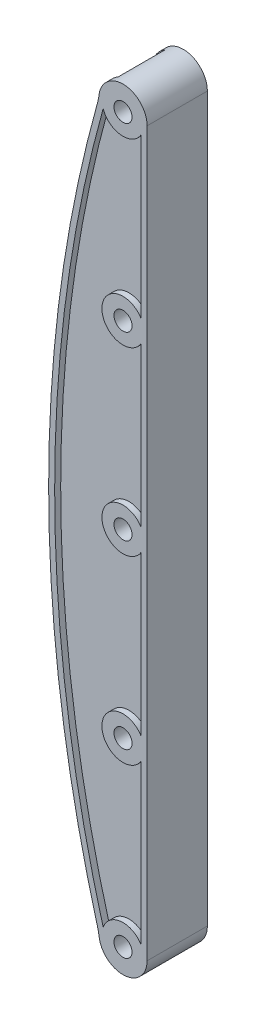
ISO-10303-21;
HEADER;
FILE_DESCRIPTION(('STEP AP214'),'2;1');
FILE_NAME('part.step','',(''),(''),'','','');
FILE_SCHEMA(('AUTOMOTIVE_DESIGN { 1 0 10303 214 1 1 1 1 }'));
ENDSEC;
DATA;
#1=APPLICATION_CONTEXT('core data for automotive mechanical design processes');
#2=APPLICATION_PROTOCOL_DEFINITION('international standard','automotive_design',2000,#1);
#3=PRODUCT_CONTEXT('',#1,'mechanical');
#4=PRODUCT('Part','Part','',(#3));
#5=PRODUCT_RELATED_PRODUCT_CATEGORY('part','',(#4));
#6=PRODUCT_DEFINITION_FORMATION('','',#4);
#7=PRODUCT_DEFINITION_CONTEXT('part definition',#1,'design');
#8=PRODUCT_DEFINITION('design','',#6,#7);
#9=PRODUCT_DEFINITION_SHAPE('','',#8);
#10=(LENGTH_UNIT() NAMED_UNIT(*) SI_UNIT(.MILLI.,.METRE.));
#11=(NAMED_UNIT(*) PLANE_ANGLE_UNIT() SI_UNIT($,.RADIAN.));
#12=(NAMED_UNIT(*) SI_UNIT($,.STERADIAN.) SOLID_ANGLE_UNIT());
#13=UNCERTAINTY_MEASURE_WITH_UNIT(LENGTH_MEASURE(1.E-05),#10,'distance_accuracy_value','');
#14=(GEOMETRIC_REPRESENTATION_CONTEXT(3) GLOBAL_UNCERTAINTY_ASSIGNED_CONTEXT((#13)) GLOBAL_UNIT_ASSIGNED_CONTEXT((#10,
#11,#12)) REPRESENTATION_CONTEXT('',''));
#15=CARTESIAN_POINT('',(0.,0.,0.));
#16=DIRECTION('',(0.,0.,1.));
#17=DIRECTION('',(1.,0.,0.));
#18=AXIS2_PLACEMENT_3D('',#15,#16,#17);
#19=CARTESIAN_POINT('',(0.,60.,5.));
#20=DIRECTION('',(0.,0.,-1.));
#21=DIRECTION('',(-1.,0.,0.));
#22=AXIS2_PLACEMENT_3D('',#19,#20,#21);
#23=CYLINDRICAL_SURFACE('',#22,4.);
#24=CARTESIAN_POINT('',(0.,60.,-3.9));
#25=DIRECTION('',(0.,0.,1.));
#26=DIRECTION('',(1.,0.,0.));
#27=AXIS2_PLACEMENT_3D('',#24,#25,#26);
#28=CIRCLE('',#27,4.);
#29=CARTESIAN_POINT('',(-1.9308097651756,63.5031376865167,-3.9));
#30=VERTEX_POINT('',#29);
#31=CARTESIAN_POINT('',(-3.96732538080456,60.5102247767648,-3.9));
#32=VERTEX_POINT('',#31);
#33=EDGE_CURVE('E210',#30,#32,#28,.T.);
#34=ORIENTED_EDGE('',*,*,#33,.F.);
#35=DIRECTION('',(0.,0.,1.));
#36=VECTOR('',#35,1.);
#37=CARTESIAN_POINT('',(-1.93080976517515,63.5031376865182,0.));
#38=LINE('',#37,#36);
#39=CARTESIAN_POINT('',(-1.9308097651756,63.5031376865167,3.9));
#40=VERTEX_POINT('',#39);
#41=EDGE_CURVE('E202',#40,#30,#38,.F.);
#42=ORIENTED_EDGE('',*,*,#41,.F.);
#43=CARTESIAN_POINT('',(0.,60.,3.9));
#44=DIRECTION('',(0.,0.,1.));
#45=DIRECTION('',(1.,0.,0.));
#46=AXIS2_PLACEMENT_3D('',#43,#44,#45);
#47=CIRCLE('',#46,4.);
#48=CARTESIAN_POINT('',(-3.96732538080456,60.5102247767648,3.9));
#49=VERTEX_POINT('',#48);
#50=EDGE_CURVE('E187',#40,#49,#47,.T.);
#51=ORIENTED_EDGE('',*,*,#50,.T.);
#52=DIRECTION('',(0.,0.,-1.));
#53=VECTOR('',#52,1.);
#54=CARTESIAN_POINT('',(-3.96732538080449,60.5102247767648,5.));
#55=LINE('',#54,#53);
#56=CARTESIAN_POINT('',(-3.96732538080449,60.5102247767648,5.));
#57=VERTEX_POINT('',#56);
#58=EDGE_CURVE('E395',#49,#57,#55,.F.);
#59=ORIENTED_EDGE('',*,*,#58,.T.);
#60=CARTESIAN_POINT('',(0.,60.,5.));
#61=DIRECTION('',(0.,0.,1.));
#62=DIRECTION('',(-1.,0.,0.));
#63=AXIS2_PLACEMENT_3D('',#60,#61,#62);
#64=CIRCLE('',#63,4.);
#65=CARTESIAN_POINT('',(3.99999999999998,60.,5.));
#66=VERTEX_POINT('',#65);
#67=EDGE_CURVE('E345',#66,#57,#64,.T.);
#68=ORIENTED_EDGE('',*,*,#67,.F.);
#69=DIRECTION('',(0.,0.,-1.));
#70=VECTOR('',#69,1.);
#71=CARTESIAN_POINT('',(3.99999999999998,60.,5.));
#72=LINE('',#71,#70);
#73=CARTESIAN_POINT('',(3.99999999999998,60.,-5.));
#74=VERTEX_POINT('',#73);
#75=EDGE_CURVE('E360',#66,#74,#72,.T.);
#76=ORIENTED_EDGE('',*,*,#75,.T.);
#77=CARTESIAN_POINT('',(0.,60.,-5.));
#78=DIRECTION('',(0.,0.,1.));
#79=DIRECTION('',(-1.,0.,0.));
#80=AXIS2_PLACEMENT_3D('',#77,#78,#79);
#81=CIRCLE('',#80,4.);
#82=CARTESIAN_POINT('',(-3.96732538080449,60.5102247767648,-5.));
#83=VERTEX_POINT('',#82);
#84=EDGE_CURVE('E341',#74,#83,#81,.T.);
#85=ORIENTED_EDGE('',*,*,#84,.T.);
#86=EDGE_CURVE('E396',#83,#32,#55,.F.);
#87=ORIENTED_EDGE('',*,*,#86,.T.);
#88=EDGE_LOOP('',(#34,#42,#51,#59,#68,#76,#85,#87));
#89=FACE_BOUND('',#88,.T.);
#90=ADVANCED_FACE('F39',(#89),#23,.T.);
#91=CARTESIAN_POINT('',(207.660104885167,0.,5.));
#92=DIRECTION('',(0.,0.,-1.));
#93=DIRECTION('',(-1.,0.,0.));
#94=AXIS2_PLACEMENT_3D('',#91,#92,#93);
#95=CYLINDRICAL_SURFACE('',#94,220.);
#96=CARTESIAN_POINT('',(207.660104885167,0.,-3.9));
#97=DIRECTION('',(0.,0.,1.));
#98=DIRECTION('',(1.,0.,0.));
#99=AXIS2_PLACEMENT_3D('',#96,#97,#98);
#100=CIRCLE('',#99,220.);
#101=CARTESIAN_POINT('',(-4.25321519290343,59.0994481656908,-3.9));
#102=VERTEX_POINT('',#101);
#103=CARTESIAN_POINT('',(-4.25321519290328,-59.0994481656913,-3.9));
#104=VERTEX_POINT('',#103);
#105=EDGE_CURVE('E417',#102,#104,#100,.T.);
#106=ORIENTED_EDGE('',*,*,#105,.F.);
#107=DIRECTION('',(0.,0.,-1.));
#108=VECTOR('',#107,1.);
#109=CARTESIAN_POINT('',(-4.25321519290348,59.0994481656908,5.));
#110=LINE('',#109,#108);
#111=CARTESIAN_POINT('',(-4.25321519290345,59.0994481656908,-5.));
#112=VERTEX_POINT('',#111);
#113=EDGE_CURVE('E385',#102,#112,#110,.T.);
#114=ORIENTED_EDGE('',*,*,#113,.T.);
#115=CARTESIAN_POINT('',(207.660104885167,0.,-5.));
#116=DIRECTION('',(0.,0.,1.));
#117=DIRECTION('',(1.,0.,0.));
#118=AXIS2_PLACEMENT_3D('',#115,#116,#117);
#119=CIRCLE('',#118,220.);
#120=CARTESIAN_POINT('',(-4.25321519290328,-59.0994481656913,-5.));
#121=VERTEX_POINT('',#120);
#122=EDGE_CURVE('E364',#112,#121,#119,.T.);
#123=ORIENTED_EDGE('',*,*,#122,.T.);
#124=DIRECTION('',(0.,0.,-1.));
#125=VECTOR('',#124,1.);
#126=CARTESIAN_POINT('',(-4.25321519290328,-59.0994481656913,5.));
#127=LINE('',#126,#125);
#128=EDGE_CURVE('E391',#121,#104,#127,.F.);
#129=ORIENTED_EDGE('',*,*,#128,.T.);
#130=EDGE_LOOP('',(#106,#114,#123,#129));
#131=FACE_BOUND('',#130,.T.);
#132=ADVANCED_FACE('F423',(#131),#95,.T.);
#133=CARTESIAN_POINT('',(0.,-60.,5.));
#134=DIRECTION('',(0.,0.,-1.));
#135=DIRECTION('',(-1.,0.,0.));
#136=AXIS2_PLACEMENT_3D('',#133,#134,#135);
#137=CYLINDRICAL_SURFACE('',#136,4.);
#138=CARTESIAN_POINT('',(0.,-60.,-3.9));
#139=DIRECTION('',(0.,0.,1.));
#140=DIRECTION('',(1.,0.,0.));
#141=AXIS2_PLACEMENT_3D('',#138,#139,#140);
#142=CIRCLE('',#141,4.);
#143=CARTESIAN_POINT('',(-3.96732538080447,-60.5102247767649,-3.9));
#144=VERTEX_POINT('',#143);
#145=CARTESIAN_POINT('',(-1.9308097651756,-63.5031376865167,-3.9));
#146=VERTEX_POINT('',#145);
#147=EDGE_CURVE('E212',#144,#146,#142,.T.);
#148=ORIENTED_EDGE('',*,*,#147,.F.);
#149=DIRECTION('',(0.,0.,-1.));
#150=VECTOR('',#149,1.);
#151=CARTESIAN_POINT('',(-3.96732538080447,-60.5102247767649,5.));
#152=LINE('',#151,#150);
#153=CARTESIAN_POINT('',(-3.96732538080447,-60.5102247767649,-5.));
#154=VERTEX_POINT('',#153);
#155=EDGE_CURVE('E380',#144,#154,#152,.T.);
#156=ORIENTED_EDGE('',*,*,#155,.T.);
#157=CARTESIAN_POINT('',(0.,-60.,-5.));
#158=DIRECTION('',(0.,0.,1.));
#159=DIRECTION('',(1.,0.,0.));
#160=AXIS2_PLACEMENT_3D('',#157,#158,#159);
#161=CIRCLE('',#160,4.);
#162=CARTESIAN_POINT('',(3.99999999999998,-60.,-5.));
#163=VERTEX_POINT('',#162);
#164=EDGE_CURVE('E368',#154,#163,#161,.T.);
#165=ORIENTED_EDGE('',*,*,#164,.T.);
#166=DIRECTION('',(0.,0.,-1.));
#167=VECTOR('',#166,1.);
#168=CARTESIAN_POINT('',(3.99999999999998,-60.,5.));
#169=LINE('',#168,#167);
#170=CARTESIAN_POINT('',(3.99999999999998,-60.,5.));
#171=VERTEX_POINT('',#170);
#172=EDGE_CURVE('E376',#171,#163,#169,.T.);
#173=ORIENTED_EDGE('',*,*,#172,.F.);
#174=CARTESIAN_POINT('',(0.,-60.,5.));
#175=DIRECTION('',(0.,0.,1.));
#176=DIRECTION('',(1.,0.,0.));
#177=AXIS2_PLACEMENT_3D('',#174,#175,#176);
#178=CIRCLE('',#177,4.);
#179=CARTESIAN_POINT('',(-3.96732538080447,-60.5102247767649,5.));
#180=VERTEX_POINT('',#179);
#181=EDGE_CURVE('E354',#180,#171,#178,.T.);
#182=ORIENTED_EDGE('',*,*,#181,.F.);
#183=CARTESIAN_POINT('',(-3.96732538080447,-60.5102247767649,3.9));
#184=VERTEX_POINT('',#183);
#185=EDGE_CURVE('E381',#180,#184,#152,.T.);
#186=ORIENTED_EDGE('',*,*,#185,.T.);
#187=CARTESIAN_POINT('',(0.,-60.,3.9));
#188=DIRECTION('',(0.,0.,1.));
#189=DIRECTION('',(1.,0.,0.));
#190=AXIS2_PLACEMENT_3D('',#187,#188,#189);
#191=CIRCLE('',#190,4.);
#192=CARTESIAN_POINT('',(-1.9308097651756,-63.5031376865167,3.9));
#193=VERTEX_POINT('',#192);
#194=EDGE_CURVE('E427',#184,#193,#191,.T.);
#195=ORIENTED_EDGE('',*,*,#194,.T.);
#196=DIRECTION('',(0.,0.,1.));
#197=VECTOR('',#196,1.);
#198=CARTESIAN_POINT('',(-1.93080976517518,-63.5031376865182,0.));
#199=LINE('',#198,#197);
#200=EDGE_CURVE('E11',#146,#193,#199,.T.);
#201=ORIENTED_EDGE('',*,*,#200,.F.);
#202=EDGE_LOOP('',(#148,#156,#165,#173,#182,#186,#195,#201));
#203=FACE_BOUND('',#202,.T.);
#204=ADVANCED_FACE('F507',(#203),#137,.T.);
#205=CARTESIAN_POINT('',(-13.8856388328156,-61.7857867186773,5.));
#206=DIRECTION('',(0.,0.,1.));
#207=DIRECTION('',(1.,0.,0.));
#208=AXIS2_PLACEMENT_3D('',#205,#206,#207);
#209=CYLINDRICAL_SURFACE('',#208,10.);
#210=CARTESIAN_POINT('',(-13.8856388328156,-61.7857867186773,-3.9));
#211=DIRECTION('',(0.,0.,1.));
#212=DIRECTION('',(1.,0.,0.));
#213=AXIS2_PLACEMENT_3D('',#210,#211,#212);
#214=CIRCLE('',#213,10.);
#215=EDGE_CURVE('E218',#104,#144,#214,.F.);
#216=ORIENTED_EDGE('',*,*,#215,.F.);
#217=ORIENTED_EDGE('',*,*,#128,.F.);
#218=CARTESIAN_POINT('',(-13.8856388328156,-61.7857867186773,-5.));
#219=DIRECTION('',(0.,0.,-1.));
#220=DIRECTION('',(-1.,0.,0.));
#221=AXIS2_PLACEMENT_3D('',#218,#219,#220);
#222=CIRCLE('',#221,10.);
#223=EDGE_CURVE('E399',#154,#121,#222,.F.);
#224=ORIENTED_EDGE('',*,*,#223,.F.);
#225=ORIENTED_EDGE('',*,*,#155,.F.);
#226=EDGE_LOOP('',(#216,#217,#224,#225));
#227=FACE_BOUND('',#226,.T.);
#228=ADVANCED_FACE('F515',(#227),#209,.F.);
#229=CARTESIAN_POINT('',(-13.8856388328157,61.7857867186767,5.));
#230=DIRECTION('',(0.,0.,1.));
#231=DIRECTION('',(1.,0.,0.));
#232=AXIS2_PLACEMENT_3D('',#229,#230,#231);
#233=CYLINDRICAL_SURFACE('',#232,10.);
#234=CARTESIAN_POINT('',(-13.8856388328157,61.7857867186767,-3.9));
#235=DIRECTION('',(0.,0.,1.));
#236=DIRECTION('',(1.,0.,0.));
#237=AXIS2_PLACEMENT_3D('',#234,#235,#236);
#238=CIRCLE('',#237,10.);
#239=EDGE_CURVE('E48',#32,#102,#238,.F.);
#240=ORIENTED_EDGE('',*,*,#239,.F.);
#241=ORIENTED_EDGE('',*,*,#86,.F.);
#242=CARTESIAN_POINT('',(-13.8856388328157,61.7857867186767,-5.));
#243=DIRECTION('',(0.,0.,-1.));
#244=DIRECTION('',(-1.,0.,0.));
#245=AXIS2_PLACEMENT_3D('',#242,#243,#244);
#246=CIRCLE('',#245,10.);
#247=EDGE_CURVE('E405',#112,#83,#246,.F.);
#248=ORIENTED_EDGE('',*,*,#247,.F.);
#249=ORIENTED_EDGE('',*,*,#113,.F.);
#250=EDGE_LOOP('',(#240,#241,#248,#249));
#251=FACE_BOUND('',#250,.T.);
#252=ADVANCED_FACE('F429',(#251),#233,.F.);
#253=CARTESIAN_POINT('',(0.,60.,5.));
#254=DIRECTION('',(0.,0.,-1.));
#255=DIRECTION('',(-1.,0.,0.));
#256=AXIS2_PLACEMENT_3D('',#253,#254,#255);
#257=PLANE('',#256);
#258=CARTESIAN_POINT('',(0.,-60.,5.));
#259=DIRECTION('',(0.,0.,1.));
#260=DIRECTION('',(1.,0.,0.));
#261=AXIS2_PLACEMENT_3D('',#258,#259,#260);
#262=CIRCLE('',#261,1.5);
#263=CARTESIAN_POINT('',(1.50000000000001,-60.,5.));
#264=VERTEX_POINT('',#263);
#265=EDGE_CURVE('E305',#264,#264,#262,.T.);
#266=ORIENTED_EDGE('',*,*,#265,.F.);
#267=EDGE_LOOP('',(#266));
#268=FACE_BOUND('',#267,.T.);
#269=CARTESIAN_POINT('',(0.,0.,5.));
#270=DIRECTION('',(0.,0.,1.));
#271=DIRECTION('',(1.,0.,0.));
#272=AXIS2_PLACEMENT_3D('',#269,#270,#271);
#273=CIRCLE('',#272,1.5);
#274=CARTESIAN_POINT('',(1.5,0.,5.));
#275=VERTEX_POINT('',#274);
#276=EDGE_CURVE('E313',#275,#275,#273,.T.);
#277=ORIENTED_EDGE('',*,*,#276,.F.);
#278=EDGE_LOOP('',(#277));
#279=FACE_BOUND('',#278,.T.);
#280=CARTESIAN_POINT('',(0.,-30.,5.));
#281=DIRECTION('',(0.,0.,1.));
#282=DIRECTION('',(1.,0.,0.));
#283=AXIS2_PLACEMENT_3D('',#280,#281,#282);
#284=CIRCLE('',#283,1.5);
#285=CARTESIAN_POINT('',(1.50000000000001,-30.,5.));
#286=VERTEX_POINT('',#285);
#287=EDGE_CURVE('E321',#286,#286,#284,.T.);
#288=ORIENTED_EDGE('',*,*,#287,.F.);
#289=EDGE_LOOP('',(#288));
#290=FACE_BOUND('',#289,.T.);
#291=CARTESIAN_POINT('',(0.,30.,5.));
#292=DIRECTION('',(0.,0.,1.));
#293=DIRECTION('',(1.,0.,0.));
#294=AXIS2_PLACEMENT_3D('',#291,#292,#293);
#295=CIRCLE('',#294,1.5);
#296=CARTESIAN_POINT('',(1.5,30.,5.));
#297=VERTEX_POINT('',#296);
#298=EDGE_CURVE('E329',#297,#297,#295,.T.);
#299=ORIENTED_EDGE('',*,*,#298,.F.);
#300=EDGE_LOOP('',(#299));
#301=FACE_BOUND('',#300,.T.);
#302=CARTESIAN_POINT('',(0.,60.,5.));
#303=DIRECTION('',(0.,0.,1.));
#304=DIRECTION('',(1.,0.,0.));
#305=AXIS2_PLACEMENT_3D('',#302,#303,#304);
#306=CIRCLE('',#305,1.5);
#307=CARTESIAN_POINT('',(1.49999999999998,60.,5.));
#308=VERTEX_POINT('',#307);
#309=EDGE_CURVE('E337',#308,#308,#306,.T.);
#310=ORIENTED_EDGE('',*,*,#309,.F.);
#311=EDGE_LOOP('',(#310));
#312=FACE_BOUND('',#311,.T.);
#313=ORIENTED_EDGE('',*,*,#67,.T.);
#314=CARTESIAN_POINT('',(-13.8856388328157,61.7857867186767,5.));
#315=DIRECTION('',(0.,0.,-1.));
#316=DIRECTION('',(-1.,0.,0.));
#317=AXIS2_PLACEMENT_3D('',#314,#315,#316);
#318=CIRCLE('',#317,10.);
#319=CARTESIAN_POINT('',(-4.25321519290345,59.0994481656908,5.));
#320=VERTEX_POINT('',#319);
#321=EDGE_CURVE('E408',#57,#320,#318,.T.);
#322=ORIENTED_EDGE('',*,*,#321,.T.);
#323=CARTESIAN_POINT('',(207.660104885167,0.,5.));
#324=DIRECTION('',(0.,0.,1.));
#325=DIRECTION('',(1.,0.,0.));
#326=AXIS2_PLACEMENT_3D('',#323,#324,#325);
#327=CIRCLE('',#326,220.);
#328=CARTESIAN_POINT('',(-4.25321519290328,-59.0994481656913,5.));
#329=VERTEX_POINT('',#328);
#330=EDGE_CURVE('E349',#320,#329,#327,.T.);
#331=ORIENTED_EDGE('',*,*,#330,.T.);
#332=CARTESIAN_POINT('',(-13.8856388328156,-61.7857867186773,5.));
#333=DIRECTION('',(0.,0.,-1.));
#334=DIRECTION('',(-1.,0.,0.));
#335=AXIS2_PLACEMENT_3D('',#332,#333,#334);
#336=CIRCLE('',#335,10.);
#337=EDGE_CURVE('E402',#329,#180,#336,.T.);
#338=ORIENTED_EDGE('',*,*,#337,.T.);
#339=ORIENTED_EDGE('',*,*,#181,.T.);
#340=DIRECTION('',(0.,1.,0.));
#341=VECTOR('',#340,1.);
#342=CARTESIAN_POINT('',(3.99999999999998,60.,5.));
#343=LINE('',#342,#341);
#344=EDGE_CURVE('E357',#171,#66,#343,.T.);
#345=ORIENTED_EDGE('',*,*,#344,.T.);
#346=EDGE_LOOP('',(#313,#322,#331,#338,#339,#345));
#347=FACE_BOUND('',#346,.T.);
#348=CARTESIAN_POINT('',(0.,-60.,5.));
#349=DIRECTION('',(0.,0.,1.));
#350=DIRECTION('',(1.,0.,0.));
#351=AXIS2_PLACEMENT_3D('',#348,#349,#350);
#352=CIRCLE('',#351,3.5);
#353=CARTESIAN_POINT('',(2.99999999999998,-58.1972243622679,5.));
#354=VERTEX_POINT('',#353);
#355=CARTESIAN_POINT('',(-3.29390642146038,-58.8167077763047,5.));
#356=VERTEX_POINT('',#355);
#357=EDGE_CURVE('E63',#354,#356,#352,.T.);
#358=ORIENTED_EDGE('',*,*,#357,.T.);
#359=CARTESIAN_POINT('',(207.660104885167,0.,5.));
#360=DIRECTION('',(0.,0.,1.));
#361=DIRECTION('',(1.,0.,0.));
#362=AXIS2_PLACEMENT_3D('',#359,#360,#361);
#363=CIRCLE('',#362,219.);
#364=CARTESIAN_POINT('',(-3.29390642146068,58.8167077763037,5.));
#365=VERTEX_POINT('',#364);
#366=EDGE_CURVE('E226',#365,#356,#363,.T.);
#367=ORIENTED_EDGE('',*,*,#366,.F.);
#368=CARTESIAN_POINT('',(0.,60.,5.));
#369=DIRECTION('',(0.,0.,1.));
#370=DIRECTION('',(1.,0.,0.));
#371=AXIS2_PLACEMENT_3D('',#368,#369,#370);
#372=CIRCLE('',#371,3.5);
#373=CARTESIAN_POINT('',(2.99999999999998,58.197224362268,5.));
#374=VERTEX_POINT('',#373);
#375=EDGE_CURVE('E268',#365,#374,#372,.T.);
#376=ORIENTED_EDGE('',*,*,#375,.T.);
#377=DIRECTION('',(0.,1.,0.));
#378=VECTOR('',#377,1.);
#379=CARTESIAN_POINT('',(2.99999999999998,0.,5.));
#380=LINE('',#379,#378);
#381=CARTESIAN_POINT('',(2.99999999999998,31.802775637732,5.));
#382=VERTEX_POINT('',#381);
#383=EDGE_CURVE('E254',#382,#374,#380,.T.);
#384=ORIENTED_EDGE('',*,*,#383,.F.);
#385=CARTESIAN_POINT('',(0.,30.,5.));
#386=DIRECTION('',(0.,0.,1.));
#387=DIRECTION('',(1.,0.,0.));
#388=AXIS2_PLACEMENT_3D('',#385,#386,#387);
#389=CIRCLE('',#388,3.5);
#390=CARTESIAN_POINT('',(2.99999999999998,28.197224362268,5.));
#391=VERTEX_POINT('',#390);
#392=EDGE_CURVE('E264',#382,#391,#389,.T.);
#393=ORIENTED_EDGE('',*,*,#392,.T.);
#394=CARTESIAN_POINT('',(2.99999999999998,1.80277563773203,5.));
#395=VERTEX_POINT('',#394);
#396=EDGE_CURVE('E263',#395,#391,#380,.T.);
#397=ORIENTED_EDGE('',*,*,#396,.F.);
#398=CARTESIAN_POINT('',(0.,0.,5.));
#399=DIRECTION('',(0.,0.,1.));
#400=DIRECTION('',(1.,0.,0.));
#401=AXIS2_PLACEMENT_3D('',#398,#399,#400);
#402=CIRCLE('',#401,3.5);
#403=CARTESIAN_POINT('',(2.99999999999998,-1.80277563773203,5.));
#404=VERTEX_POINT('',#403);
#405=EDGE_CURVE('E259',#395,#404,#402,.T.);
#406=ORIENTED_EDGE('',*,*,#405,.T.);
#407=CARTESIAN_POINT('',(2.99999999999998,-28.197224362268,5.));
#408=VERTEX_POINT('',#407);
#409=EDGE_CURVE('E255',#408,#404,#380,.T.);
#410=ORIENTED_EDGE('',*,*,#409,.F.);
#411=CARTESIAN_POINT('',(0.,-30.,5.));
#412=DIRECTION('',(0.,0.,1.));
#413=DIRECTION('',(1.,0.,0.));
#414=AXIS2_PLACEMENT_3D('',#411,#412,#413);
#415=CIRCLE('',#414,3.5);
#416=CARTESIAN_POINT('',(2.99999999999998,-31.8027756377321,5.));
#417=VERTEX_POINT('',#416);
#418=EDGE_CURVE('E253',#408,#417,#415,.T.);
#419=ORIENTED_EDGE('',*,*,#418,.T.);
#420=EDGE_CURVE('E216',#354,#417,#380,.T.);
#421=ORIENTED_EDGE('',*,*,#420,.F.);
#422=EDGE_LOOP('',(#358,#367,#376,#384,#393,#397,#406,#410,#419,#421));
#423=FACE_BOUND('',#422,.T.);
#424=ADVANCED_FACE('F455',(#268,#279,#290,#301,#312,#347,#423),#257,.F.);
#425=CARTESIAN_POINT('',(0.,60.,-5.));
#426=DIRECTION('',(0.,0.,-1.));
#427=DIRECTION('',(-1.,0.,0.));
#428=AXIS2_PLACEMENT_3D('',#425,#426,#427);
#429=PLANE('',#428);
#430=CARTESIAN_POINT('',(0.,0.,-5.));
#431=DIRECTION('',(0.,0.,1.));
#432=DIRECTION('',(1.,0.,0.));
#433=AXIS2_PLACEMENT_3D('',#430,#431,#432);
#434=CIRCLE('',#433,1.5);
#435=CARTESIAN_POINT('',(1.5,0.,-5.));
#436=VERTEX_POINT('',#435);
#437=EDGE_CURVE('E309',#436,#436,#434,.T.);
#438=ORIENTED_EDGE('',*,*,#437,.T.);
#439=EDGE_LOOP('',(#438));
#440=FACE_BOUND('',#439,.T.);
#441=CARTESIAN_POINT('',(0.,30.,-5.));
#442=DIRECTION('',(0.,0.,1.));
#443=DIRECTION('',(1.,0.,0.));
#444=AXIS2_PLACEMENT_3D('',#441,#442,#443);
#445=CIRCLE('',#444,1.5);
#446=CARTESIAN_POINT('',(1.5,30.,-5.));
#447=VERTEX_POINT('',#446);
#448=EDGE_CURVE('E325',#447,#447,#445,.T.);
#449=ORIENTED_EDGE('',*,*,#448,.T.);
#450=EDGE_LOOP('',(#449));
#451=FACE_BOUND('',#450,.T.);
#452=ORIENTED_EDGE('',*,*,#84,.F.);
#453=DIRECTION('',(0.,1.,0.));
#454=VECTOR('',#453,1.);
#455=CARTESIAN_POINT('',(3.99999999999998,60.,-5.));
#456=LINE('',#455,#454);
#457=EDGE_CURVE('E350',#163,#74,#456,.T.);
#458=ORIENTED_EDGE('',*,*,#457,.F.);
#459=ORIENTED_EDGE('',*,*,#164,.F.);
#460=ORIENTED_EDGE('',*,*,#223,.T.);
#461=ORIENTED_EDGE('',*,*,#122,.F.);
#462=ORIENTED_EDGE('',*,*,#247,.T.);
#463=EDGE_LOOP('',(#452,#458,#459,#460,#461,#462));
#464=FACE_BOUND('',#463,.T.);
#465=CARTESIAN_POINT('',(0.,60.,-5.));
#466=DIRECTION('',(0.,0.,1.));
#467=DIRECTION('',(1.,0.,0.));
#468=AXIS2_PLACEMENT_3D('',#465,#466,#467);
#469=CIRCLE('',#468,1.5);
#470=CARTESIAN_POINT('',(1.49999999999998,60.,-5.));
#471=VERTEX_POINT('',#470);
#472=EDGE_CURVE('E333',#471,#471,#469,.T.);
#473=ORIENTED_EDGE('',*,*,#472,.T.);
#474=EDGE_LOOP('',(#473));
#475=FACE_BOUND('',#474,.T.);
#476=CARTESIAN_POINT('',(0.,-30.,-5.));
#477=DIRECTION('',(0.,0.,1.));
#478=DIRECTION('',(1.,0.,0.));
#479=AXIS2_PLACEMENT_3D('',#476,#477,#478);
#480=CIRCLE('',#479,1.5);
#481=CARTESIAN_POINT('',(1.50000000000001,-30.,-5.));
#482=VERTEX_POINT('',#481);
#483=EDGE_CURVE('E317',#482,#482,#480,.T.);
#484=ORIENTED_EDGE('',*,*,#483,.T.);
#485=EDGE_LOOP('',(#484));
#486=FACE_BOUND('',#485,.T.);
#487=CARTESIAN_POINT('',(0.,-60.,-5.));
#488=DIRECTION('',(0.,0.,1.));
#489=DIRECTION('',(1.,0.,0.));
#490=AXIS2_PLACEMENT_3D('',#487,#488,#489);
#491=CIRCLE('',#490,1.5);
#492=CARTESIAN_POINT('',(1.50000000000001,-60.,-5.));
#493=VERTEX_POINT('',#492);
#494=EDGE_CURVE('E278',#493,#493,#491,.T.);
#495=ORIENTED_EDGE('',*,*,#494,.T.);
#496=EDGE_LOOP('',(#495));
#497=FACE_BOUND('',#496,.T.);
#498=ADVANCED_FACE('F566',(#440,#451,#464,#475,#486,#497),#429,.T.);
#499=CARTESIAN_POINT('',(-4.25321519290348,59.0994481656908,3.9));
#500=VERTEX_POINT('',#499);
#501=EDGE_CURVE('E386',#320,#500,#110,.T.);
#502=ORIENTED_EDGE('',*,*,#501,.T.);
#503=CARTESIAN_POINT('',(207.660104885167,0.,3.9));
#504=DIRECTION('',(0.,0.,1.));
#505=DIRECTION('',(1.,0.,0.));
#506=AXIS2_PLACEMENT_3D('',#503,#504,#505);
#507=CIRCLE('',#506,220.);
#508=CARTESIAN_POINT('',(-4.25321519290328,-59.0994481656913,3.9));
#509=VERTEX_POINT('',#508);
#510=EDGE_CURVE('E55',#500,#509,#507,.T.);
#511=ORIENTED_EDGE('',*,*,#510,.T.);
#512=EDGE_CURVE('E390',#509,#329,#127,.F.);
#513=ORIENTED_EDGE('',*,*,#512,.T.);
#514=ORIENTED_EDGE('',*,*,#330,.F.);
#515=EDGE_LOOP('',(#502,#511,#513,#514));
#516=FACE_BOUND('',#515,.T.);
#517=ADVANCED_FACE('F509',(#516),#95,.T.);
#518=CARTESIAN_POINT('',(3.99999999999998,60.,5.));
#519=DIRECTION('',(-1.,0.,0.));
#520=DIRECTION('',(0.,0.,1.));
#521=AXIS2_PLACEMENT_3D('',#518,#519,#520);
#522=PLANE('',#521);
#523=ORIENTED_EDGE('',*,*,#457,.T.);
#524=ORIENTED_EDGE('',*,*,#75,.F.);
#525=ORIENTED_EDGE('',*,*,#344,.F.);
#526=ORIENTED_EDGE('',*,*,#172,.T.);
#527=EDGE_LOOP('',(#523,#524,#525,#526));
#528=FACE_BOUND('',#527,.T.);
#529=ADVANCED_FACE('F563',(#528),#522,.F.);
#530=CARTESIAN_POINT('',(0.,60.,5.));
#531=DIRECTION('',(0.,0.,-1.));
#532=DIRECTION('',(-1.,0.,0.));
#533=AXIS2_PLACEMENT_3D('',#530,#531,#532);
#534=CYLINDRICAL_SURFACE('',#533,1.5);
#535=ORIENTED_EDGE('',*,*,#309,.T.);
#536=EDGE_LOOP('',(#535));
#537=FACE_BOUND('',#536,.T.);
#538=ORIENTED_EDGE('',*,*,#472,.F.);
#539=EDGE_LOOP('',(#538));
#540=FACE_BOUND('',#539,.T.);
#541=ADVANCED_FACE('F589',(#537,#540),#534,.F.);
#542=CARTESIAN_POINT('',(0.,30.,5.));
#543=DIRECTION('',(0.,0.,-1.));
#544=DIRECTION('',(-1.,0.,0.));
#545=AXIS2_PLACEMENT_3D('',#542,#543,#544);
#546=CYLINDRICAL_SURFACE('',#545,1.5);
#547=ORIENTED_EDGE('',*,*,#298,.T.);
#548=EDGE_LOOP('',(#547));
#549=FACE_BOUND('',#548,.T.);
#550=ORIENTED_EDGE('',*,*,#448,.F.);
#551=EDGE_LOOP('',(#550));
#552=FACE_BOUND('',#551,.T.);
#553=ADVANCED_FACE('F580',(#549,#552),#546,.F.);
#554=CARTESIAN_POINT('',(0.,-30.,5.));
#555=DIRECTION('',(0.,0.,-1.));
#556=DIRECTION('',(-1.,0.,0.));
#557=AXIS2_PLACEMENT_3D('',#554,#555,#556);
#558=CYLINDRICAL_SURFACE('',#557,1.5);
#559=ORIENTED_EDGE('',*,*,#287,.T.);
#560=EDGE_LOOP('',(#559));
#561=FACE_BOUND('',#560,.T.);
#562=ORIENTED_EDGE('',*,*,#483,.F.);
#563=EDGE_LOOP('',(#562));
#564=FACE_BOUND('',#563,.T.);
#565=ADVANCED_FACE('F578',(#561,#564),#558,.F.);
#566=CARTESIAN_POINT('',(0.,0.,5.));
#567=DIRECTION('',(0.,0.,-1.));
#568=DIRECTION('',(-1.,0.,0.));
#569=AXIS2_PLACEMENT_3D('',#566,#567,#568);
#570=CYLINDRICAL_SURFACE('',#569,1.5);
#571=ORIENTED_EDGE('',*,*,#276,.T.);
#572=EDGE_LOOP('',(#571));
#573=FACE_BOUND('',#572,.T.);
#574=ORIENTED_EDGE('',*,*,#437,.F.);
#575=EDGE_LOOP('',(#574));
#576=FACE_BOUND('',#575,.T.);
#577=ADVANCED_FACE('F521',(#573,#576),#570,.F.);
#578=CARTESIAN_POINT('',(0.,-60.,5.));
#579=DIRECTION('',(0.,0.,-1.));
#580=DIRECTION('',(-1.,0.,0.));
#581=AXIS2_PLACEMENT_3D('',#578,#579,#580);
#582=CYLINDRICAL_SURFACE('',#581,1.5);
#583=ORIENTED_EDGE('',*,*,#265,.T.);
#584=EDGE_LOOP('',(#583));
#585=FACE_BOUND('',#584,.T.);
#586=ORIENTED_EDGE('',*,*,#494,.F.);
#587=EDGE_LOOP('',(#586));
#588=FACE_BOUND('',#587,.T.);
#589=ADVANCED_FACE('F513',(#585,#588),#582,.F.);
#590=ORIENTED_EDGE('',*,*,#512,.F.);
#591=CARTESIAN_POINT('',(-13.8856388328156,-61.7857867186773,3.9));
#592=DIRECTION('',(0.,0.,1.));
#593=DIRECTION('',(1.,0.,0.));
#594=AXIS2_PLACEMENT_3D('',#591,#592,#593);
#595=CIRCLE('',#594,10.);
#596=EDGE_CURVE('E197',#509,#184,#595,.F.);
#597=ORIENTED_EDGE('',*,*,#596,.T.);
#598=ORIENTED_EDGE('',*,*,#185,.F.);
#599=ORIENTED_EDGE('',*,*,#337,.F.);
#600=EDGE_LOOP('',(#590,#597,#598,#599));
#601=FACE_BOUND('',#600,.T.);
#602=ADVANCED_FACE('F511',(#601),#209,.F.);
#603=ORIENTED_EDGE('',*,*,#58,.F.);
#604=CARTESIAN_POINT('',(-13.8856388328157,61.7857867186767,3.9));
#605=DIRECTION('',(0.,0.,1.));
#606=DIRECTION('',(1.,0.,0.));
#607=AXIS2_PLACEMENT_3D('',#604,#605,#606);
#608=CIRCLE('',#607,10.);
#609=EDGE_CURVE('E192',#49,#500,#608,.F.);
#610=ORIENTED_EDGE('',*,*,#609,.T.);
#611=ORIENTED_EDGE('',*,*,#501,.F.);
#612=ORIENTED_EDGE('',*,*,#321,.F.);
#613=EDGE_LOOP('',(#603,#610,#611,#612));
#614=FACE_BOUND('',#613,.T.);
#615=ADVANCED_FACE('F41',(#614),#233,.F.);
#616=CARTESIAN_POINT('',(0.,-60.,4.));
#617=DIRECTION('',(0.,0.,1.));
#618=DIRECTION('',(1.,0.,0.));
#619=AXIS2_PLACEMENT_3D('',#616,#617,#618);
#620=CYLINDRICAL_SURFACE('',#619,3.5);
#621=ORIENTED_EDGE('',*,*,#357,.F.);
#622=DIRECTION('',(0.,0.,1.));
#623=VECTOR('',#622,1.);
#624=CARTESIAN_POINT('',(2.99999999999998,-58.1972243622679,4.));
#625=LINE('',#624,#623);
#626=CARTESIAN_POINT('',(2.99999999999998,-58.1972243622679,4.));
#627=VERTEX_POINT('',#626);
#628=EDGE_CURVE('E248',#627,#354,#625,.T.);
#629=ORIENTED_EDGE('',*,*,#628,.F.);
#630=CARTESIAN_POINT('',(0.,-60.,4.));
#631=DIRECTION('',(0.,0.,1.));
#632=DIRECTION('',(1.,0.,0.));
#633=AXIS2_PLACEMENT_3D('',#630,#631,#632);
#634=CIRCLE('',#633,3.5);
#635=CARTESIAN_POINT('',(-3.29390642146038,-58.8167077763047,4.));
#636=VERTEX_POINT('',#635);
#637=EDGE_CURVE('E222',#627,#636,#634,.T.);
#638=ORIENTED_EDGE('',*,*,#637,.T.);
#639=DIRECTION('',(0.,0.,1.));
#640=VECTOR('',#639,1.);
#641=CARTESIAN_POINT('',(-3.29390642146038,-58.8167077763047,4.));
#642=LINE('',#641,#640);
#643=EDGE_CURVE('E275',#636,#356,#642,.T.);
#644=ORIENTED_EDGE('',*,*,#643,.T.);
#645=EDGE_LOOP('',(#621,#629,#638,#644));
#646=FACE_BOUND('',#645,.T.);
#647=ADVANCED_FACE('F485',(#646),#620,.T.);
#648=CARTESIAN_POINT('',(207.660104885167,0.,4.));
#649=DIRECTION('',(0.,0.,1.));
#650=DIRECTION('',(1.,0.,0.));
#651=AXIS2_PLACEMENT_3D('',#648,#649,#650);
#652=CYLINDRICAL_SURFACE('',#651,219.);
#653=ORIENTED_EDGE('',*,*,#366,.T.);
#654=ORIENTED_EDGE('',*,*,#643,.F.);
#655=CARTESIAN_POINT('',(207.660104885167,0.,4.));
#656=DIRECTION('',(0.,0.,1.));
#657=DIRECTION('',(1.,0.,0.));
#658=AXIS2_PLACEMENT_3D('',#655,#656,#657);
#659=CIRCLE('',#658,219.);
#660=CARTESIAN_POINT('',(-3.29390642146068,58.8167077763037,4.));
#661=VERTEX_POINT('',#660);
#662=EDGE_CURVE('E245',#661,#636,#659,.T.);
#663=ORIENTED_EDGE('',*,*,#662,.F.);
#664=DIRECTION('',(0.,0.,1.));
#665=VECTOR('',#664,1.);
#666=CARTESIAN_POINT('',(-3.29390642146068,58.8167077763037,4.));
#667=LINE('',#666,#665);
#668=EDGE_CURVE('E279',#661,#365,#667,.T.);
#669=ORIENTED_EDGE('',*,*,#668,.T.);
#670=EDGE_LOOP('',(#653,#654,#663,#669));
#671=FACE_BOUND('',#670,.T.);
#672=ADVANCED_FACE('F484',(#671),#652,.F.);
#673=CARTESIAN_POINT('',(0.,60.,4.));
#674=DIRECTION('',(0.,0.,1.));
#675=DIRECTION('',(1.,0.,0.));
#676=AXIS2_PLACEMENT_3D('',#673,#674,#675);
#677=CYLINDRICAL_SURFACE('',#676,3.5);
#678=ORIENTED_EDGE('',*,*,#375,.F.);
#679=ORIENTED_EDGE('',*,*,#668,.F.);
#680=CARTESIAN_POINT('',(0.,60.,4.));
#681=DIRECTION('',(0.,0.,1.));
#682=DIRECTION('',(1.,0.,0.));
#683=AXIS2_PLACEMENT_3D('',#680,#681,#682);
#684=CIRCLE('',#683,3.5);
#685=CARTESIAN_POINT('',(2.99999999999998,58.197224362268,4.));
#686=VERTEX_POINT('',#685);
#687=EDGE_CURVE('E242',#661,#686,#684,.T.);
#688=ORIENTED_EDGE('',*,*,#687,.T.);
#689=DIRECTION('',(0.,0.,1.));
#690=VECTOR('',#689,1.);
#691=CARTESIAN_POINT('',(2.99999999999998,58.197224362268,4.));
#692=LINE('',#691,#690);
#693=EDGE_CURVE('E282',#686,#374,#692,.T.);
#694=ORIENTED_EDGE('',*,*,#693,.T.);
#695=EDGE_LOOP('',(#678,#679,#688,#694));
#696=FACE_BOUND('',#695,.T.);
#697=ADVANCED_FACE('F479',(#696),#677,.T.);
#698=CARTESIAN_POINT('',(2.99999999999998,0.,4.));
#699=DIRECTION('',(1.,0.,0.));
#700=DIRECTION('',(0.,0.,-1.));
#701=AXIS2_PLACEMENT_3D('',#698,#699,#700);
#702=PLANE('',#701);
#703=ORIENTED_EDGE('',*,*,#383,.T.);
#704=ORIENTED_EDGE('',*,*,#693,.F.);
#705=DIRECTION('',(0.,1.,0.));
#706=VECTOR('',#705,1.);
#707=CARTESIAN_POINT('',(2.99999999999998,0.,4.));
#708=LINE('',#707,#706);
#709=CARTESIAN_POINT('',(2.99999999999998,31.802775637732,4.));
#710=VERTEX_POINT('',#709);
#711=EDGE_CURVE('E231',#710,#686,#708,.T.);
#712=ORIENTED_EDGE('',*,*,#711,.F.);
#713=DIRECTION('',(0.,0.,1.));
#714=VECTOR('',#713,1.);
#715=CARTESIAN_POINT('',(2.99999999999998,31.802775637732,4.));
#716=LINE('',#715,#714);
#717=EDGE_CURVE('E285',#710,#382,#716,.T.);
#718=ORIENTED_EDGE('',*,*,#717,.T.);
#719=EDGE_LOOP('',(#703,#704,#712,#718));
#720=FACE_BOUND('',#719,.T.);
#721=ADVANCED_FACE('F476',(#720),#702,.F.);
#722=CARTESIAN_POINT('',(0.,30.,4.));
#723=DIRECTION('',(0.,0.,1.));
#724=DIRECTION('',(1.,0.,0.));
#725=AXIS2_PLACEMENT_3D('',#722,#723,#724);
#726=CYLINDRICAL_SURFACE('',#725,3.5);
#727=ORIENTED_EDGE('',*,*,#392,.F.);
#728=ORIENTED_EDGE('',*,*,#717,.F.);
#729=CARTESIAN_POINT('',(0.,30.,4.));
#730=DIRECTION('',(0.,0.,1.));
#731=DIRECTION('',(1.,0.,0.));
#732=AXIS2_PLACEMENT_3D('',#729,#730,#731);
#733=CIRCLE('',#732,3.5);
#734=CARTESIAN_POINT('',(2.99999999999998,28.197224362268,4.));
#735=VERTEX_POINT('',#734);
#736=EDGE_CURVE('E239',#710,#735,#733,.T.);
#737=ORIENTED_EDGE('',*,*,#736,.T.);
#738=DIRECTION('',(0.,0.,1.));
#739=VECTOR('',#738,1.);
#740=CARTESIAN_POINT('',(2.99999999999998,28.197224362268,4.));
#741=LINE('',#740,#739);
#742=EDGE_CURVE('E288',#735,#391,#741,.T.);
#743=ORIENTED_EDGE('',*,*,#742,.T.);
#744=EDGE_LOOP('',(#727,#728,#737,#743));
#745=FACE_BOUND('',#744,.T.);
#746=ADVANCED_FACE('F470',(#745),#726,.T.);
#747=ORIENTED_EDGE('',*,*,#396,.T.);
#748=ORIENTED_EDGE('',*,*,#742,.F.);
#749=CARTESIAN_POINT('',(2.99999999999998,1.80277563773203,4.));
#750=VERTEX_POINT('',#749);
#751=EDGE_CURVE('E238',#750,#735,#708,.T.);
#752=ORIENTED_EDGE('',*,*,#751,.F.);
#753=DIRECTION('',(0.,0.,1.));
#754=VECTOR('',#753,1.);
#755=CARTESIAN_POINT('',(2.99999999999998,1.80277563773203,4.));
#756=LINE('',#755,#754);
#757=EDGE_CURVE('E291',#750,#395,#756,.T.);
#758=ORIENTED_EDGE('',*,*,#757,.T.);
#759=EDGE_LOOP('',(#747,#748,#752,#758));
#760=FACE_BOUND('',#759,.T.);
#761=ADVANCED_FACE('F467',(#760),#702,.F.);
#762=CARTESIAN_POINT('',(0.,0.,4.));
#763=DIRECTION('',(0.,0.,1.));
#764=DIRECTION('',(1.,0.,0.));
#765=AXIS2_PLACEMENT_3D('',#762,#763,#764);
#766=CYLINDRICAL_SURFACE('',#765,3.5);
#767=ORIENTED_EDGE('',*,*,#405,.F.);
#768=ORIENTED_EDGE('',*,*,#757,.F.);
#769=CARTESIAN_POINT('',(0.,0.,4.));
#770=DIRECTION('',(0.,0.,1.));
#771=DIRECTION('',(1.,0.,0.));
#772=AXIS2_PLACEMENT_3D('',#769,#770,#771);
#773=CIRCLE('',#772,3.5);
#774=CARTESIAN_POINT('',(2.99999999999998,-1.80277563773203,4.));
#775=VERTEX_POINT('',#774);
#776=EDGE_CURVE('E235',#750,#775,#773,.T.);
#777=ORIENTED_EDGE('',*,*,#776,.T.);
#778=DIRECTION('',(0.,0.,1.));
#779=VECTOR('',#778,1.);
#780=CARTESIAN_POINT('',(2.99999999999998,-1.80277563773203,4.));
#781=LINE('',#780,#779);
#782=EDGE_CURVE('E294',#775,#404,#781,.T.);
#783=ORIENTED_EDGE('',*,*,#782,.T.);
#784=EDGE_LOOP('',(#767,#768,#777,#783));
#785=FACE_BOUND('',#784,.T.);
#786=ADVANCED_FACE('F457',(#785),#766,.T.);
#787=ORIENTED_EDGE('',*,*,#409,.T.);
#788=ORIENTED_EDGE('',*,*,#782,.F.);
#789=CARTESIAN_POINT('',(2.99999999999998,-28.197224362268,4.));
#790=VERTEX_POINT('',#789);
#791=EDGE_CURVE('E232',#790,#775,#708,.T.);
#792=ORIENTED_EDGE('',*,*,#791,.F.);
#793=DIRECTION('',(0.,0.,1.));
#794=VECTOR('',#793,1.);
#795=CARTESIAN_POINT('',(2.99999999999998,-28.197224362268,4.));
#796=LINE('',#795,#794);
#797=EDGE_CURVE('E297',#790,#408,#796,.T.);
#798=ORIENTED_EDGE('',*,*,#797,.T.);
#799=EDGE_LOOP('',(#787,#788,#792,#798));
#800=FACE_BOUND('',#799,.T.);
#801=ADVANCED_FACE('F449',(#800),#702,.F.);
#802=CARTESIAN_POINT('',(0.,-30.,4.));
#803=DIRECTION('',(0.,0.,1.));
#804=DIRECTION('',(1.,0.,0.));
#805=AXIS2_PLACEMENT_3D('',#802,#803,#804);
#806=CYLINDRICAL_SURFACE('',#805,3.5);
#807=ORIENTED_EDGE('',*,*,#418,.F.);
#808=ORIENTED_EDGE('',*,*,#797,.F.);
#809=CARTESIAN_POINT('',(0.,-30.,4.));
#810=DIRECTION('',(0.,0.,1.));
#811=DIRECTION('',(1.,0.,0.));
#812=AXIS2_PLACEMENT_3D('',#809,#810,#811);
#813=CIRCLE('',#812,3.5);
#814=CARTESIAN_POINT('',(2.99999999999998,-31.8027756377321,4.));
#815=VERTEX_POINT('',#814);
#816=EDGE_CURVE('E230',#790,#815,#813,.T.);
#817=ORIENTED_EDGE('',*,*,#816,.T.);
#818=DIRECTION('',(0.,0.,1.));
#819=VECTOR('',#818,1.);
#820=CARTESIAN_POINT('',(2.99999999999998,-31.8027756377321,4.));
#821=LINE('',#820,#819);
#822=EDGE_CURVE('E300',#815,#417,#821,.T.);
#823=ORIENTED_EDGE('',*,*,#822,.T.);
#824=EDGE_LOOP('',(#807,#808,#817,#823));
#825=FACE_BOUND('',#824,.T.);
#826=ADVANCED_FACE('F492',(#825),#806,.T.);
#827=ORIENTED_EDGE('',*,*,#420,.T.);
#828=ORIENTED_EDGE('',*,*,#822,.F.);
#829=EDGE_CURVE('E225',#627,#815,#708,.T.);
#830=ORIENTED_EDGE('',*,*,#829,.F.);
#831=ORIENTED_EDGE('',*,*,#628,.T.);
#832=EDGE_LOOP('',(#827,#828,#830,#831));
#833=FACE_BOUND('',#832,.T.);
#834=ADVANCED_FACE('F489',(#833),#702,.F.);
#835=CARTESIAN_POINT('',(0.,0.,4.));
#836=DIRECTION('',(0.,0.,1.));
#837=DIRECTION('',(1.,0.,0.));
#838=AXIS2_PLACEMENT_3D('',#835,#836,#837);
#839=PLANE('',#838);
#840=ORIENTED_EDGE('',*,*,#637,.F.);
#841=ORIENTED_EDGE('',*,*,#829,.T.);
#842=ORIENTED_EDGE('',*,*,#816,.F.);
#843=ORIENTED_EDGE('',*,*,#791,.T.);
#844=ORIENTED_EDGE('',*,*,#776,.F.);
#845=ORIENTED_EDGE('',*,*,#751,.T.);
#846=ORIENTED_EDGE('',*,*,#736,.F.);
#847=ORIENTED_EDGE('',*,*,#711,.T.);
#848=ORIENTED_EDGE('',*,*,#687,.F.);
#849=ORIENTED_EDGE('',*,*,#662,.T.);
#850=EDGE_LOOP('',(#840,#841,#842,#843,#844,#845,#846,#847,#848,#849));
#851=FACE_BOUND('',#850,.T.);
#852=ADVANCED_FACE('F462',(#851),#839,.T.);
#853=CARTESIAN_POINT('',(207.660104885167,0.,-3.9));
#854=DIRECTION('',(0.,0.,1.));
#855=DIRECTION('',(1.,0.,0.));
#856=AXIS2_PLACEMENT_3D('',#853,#854,#855);
#857=CYLINDRICAL_SURFACE('',#856,219.);
#858=ORIENTED_EDGE('',*,*,#41,.T.);
#859=CARTESIAN_POINT('',(207.660104885167,0.,-3.9));
#860=DIRECTION('',(0.,0.,1.));
#861=DIRECTION('',(1.,0.,0.));
#862=AXIS2_PLACEMENT_3D('',#859,#860,#861);
#863=CIRCLE('',#862,219.);
#864=EDGE_CURVE('E206',#30,#146,#863,.T.);
#865=ORIENTED_EDGE('',*,*,#864,.T.);
#866=ORIENTED_EDGE('',*,*,#200,.T.);
#867=CARTESIAN_POINT('',(207.660104885167,0.,3.9));
#868=DIRECTION('',(0.,0.,1.));
#869=DIRECTION('',(1.,0.,0.));
#870=AXIS2_PLACEMENT_3D('',#867,#868,#869);
#871=CIRCLE('',#870,219.);
#872=EDGE_CURVE('E190',#40,#193,#871,.T.);
#873=ORIENTED_EDGE('',*,*,#872,.F.);
#874=EDGE_LOOP('',(#858,#865,#866,#873));
#875=FACE_BOUND('',#874,.T.);
#876=ADVANCED_FACE('F200',(#875),#857,.T.);
#877=CARTESIAN_POINT('',(0.,0.,-3.9));
#878=DIRECTION('',(0.,0.,1.));
#879=DIRECTION('',(1.,0.,0.));
#880=AXIS2_PLACEMENT_3D('',#877,#878,#879);
#881=PLANE('',#880);
#882=ORIENTED_EDGE('',*,*,#147,.T.);
#883=ORIENTED_EDGE('',*,*,#864,.F.);
#884=ORIENTED_EDGE('',*,*,#33,.T.);
#885=ORIENTED_EDGE('',*,*,#239,.T.);
#886=ORIENTED_EDGE('',*,*,#105,.T.);
#887=ORIENTED_EDGE('',*,*,#215,.T.);
#888=EDGE_LOOP('',(#882,#883,#884,#885,#886,#887));
#889=FACE_BOUND('',#888,.T.);
#890=ADVANCED_FACE('F416',(#889),#881,.T.);
#891=CARTESIAN_POINT('',(0.,0.,3.9));
#892=DIRECTION('',(0.,0.,1.));
#893=DIRECTION('',(1.,0.,0.));
#894=AXIS2_PLACEMENT_3D('',#891,#892,#893);
#895=PLANE('',#894);
#896=ORIENTED_EDGE('',*,*,#596,.F.);
#897=ORIENTED_EDGE('',*,*,#510,.F.);
#898=ORIENTED_EDGE('',*,*,#609,.F.);
#899=ORIENTED_EDGE('',*,*,#50,.F.);
#900=ORIENTED_EDGE('',*,*,#872,.T.);
#901=ORIENTED_EDGE('',*,*,#194,.F.);
#902=EDGE_LOOP('',(#896,#897,#898,#899,#900,#901));
#903=FACE_BOUND('',#902,.T.);
#904=ADVANCED_FACE('F189',(#903),#895,.F.);
#905=CLOSED_SHELL('',(#90,#132,#204,#228,#252,#424,#498,#517,#529,#541,#553,#565,#577,#589,#602,
#615,#647,#672,#697,#721,#746,#761,#786,#801,#826,#834,#852,#876,#890,#904));
#906=MANIFOLD_SOLID_BREP('B2',#905);
#907=ADVANCED_BREP_SHAPE_REPRESENTATION('',(#18,#906),#14);
#908=SHAPE_DEFINITION_REPRESENTATION(#9,#907);
ENDSEC;
END-ISO-10303-21;
